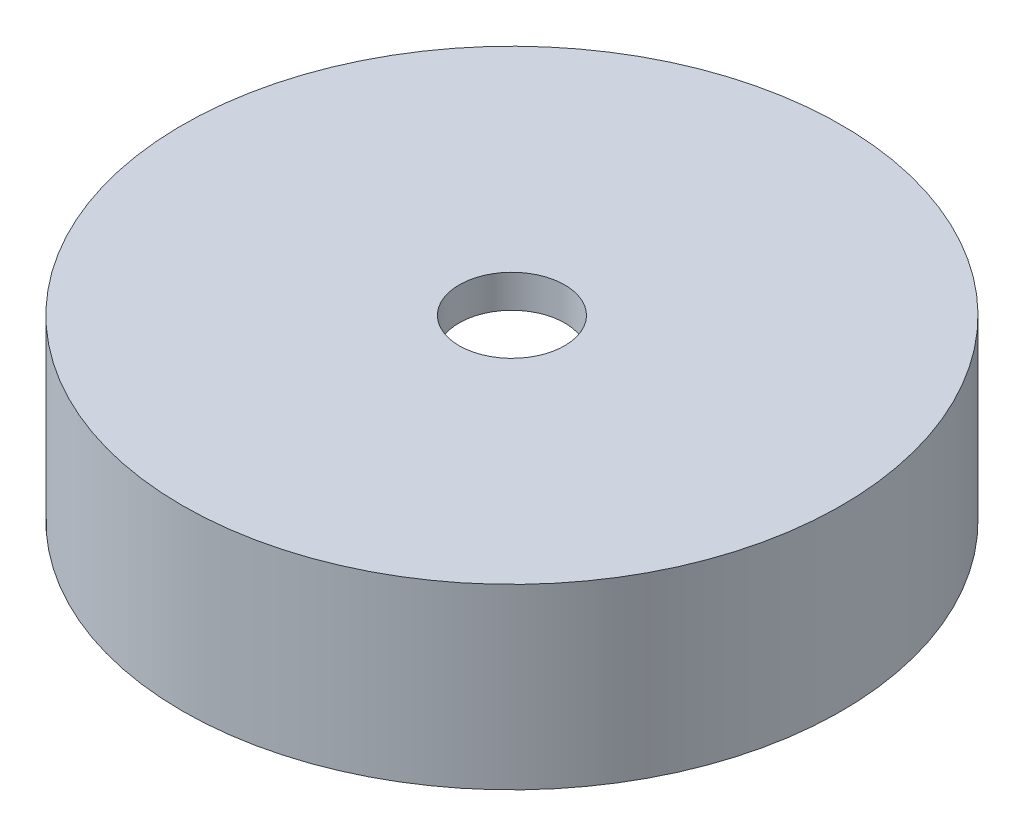
ISO-10303-21;
HEADER;
FILE_DESCRIPTION(('STEP AP214'),'2;1');
FILE_NAME('part.step','',(''),(''),'','','');
FILE_SCHEMA(('AUTOMOTIVE_DESIGN { 1 0 10303 214 1 1 1 1 }'));
ENDSEC;
DATA;
#1=APPLICATION_CONTEXT('core data for automotive mechanical design processes');
#2=APPLICATION_PROTOCOL_DEFINITION('international standard','automotive_design',2000,#1);
#3=PRODUCT_CONTEXT('',#1,'mechanical');
#4=PRODUCT('Part','Part','',(#3));
#5=PRODUCT_RELATED_PRODUCT_CATEGORY('part','',(#4));
#6=PRODUCT_DEFINITION_FORMATION('','',#4);
#7=PRODUCT_DEFINITION_CONTEXT('part definition',#1,'design');
#8=PRODUCT_DEFINITION('design','',#6,#7);
#9=PRODUCT_DEFINITION_SHAPE('','',#8);
#10=(LENGTH_UNIT() NAMED_UNIT(*) SI_UNIT(.MILLI.,.METRE.));
#11=(NAMED_UNIT(*) PLANE_ANGLE_UNIT() SI_UNIT($,.RADIAN.));
#12=(NAMED_UNIT(*) SI_UNIT($,.STERADIAN.) SOLID_ANGLE_UNIT());
#13=UNCERTAINTY_MEASURE_WITH_UNIT(LENGTH_MEASURE(1.E-05),#10,'distance_accuracy_value','');
#14=(GEOMETRIC_REPRESENTATION_CONTEXT(3) GLOBAL_UNCERTAINTY_ASSIGNED_CONTEXT((#13)) GLOBAL_UNIT_ASSIGNED_CONTEXT((#10,
#11,#12)) REPRESENTATION_CONTEXT('',''));
#15=CARTESIAN_POINT('',(0.,0.,0.));
#16=DIRECTION('',(0.,0.,1.));
#17=DIRECTION('',(1.,0.,0.));
#18=AXIS2_PLACEMENT_3D('',#15,#16,#17);
#19=CARTESIAN_POINT('',(0.,0.,0.));
#20=DIRECTION('',(0.,1.,0.));
#21=DIRECTION('',(0.,0.,1.));
#22=AXIS2_PLACEMENT_3D('',#19,#20,#21);
#23=PLANE('',#22);
#24=CARTESIAN_POINT('',(0.,0.,0.));
#25=DIRECTION('',(0.,1.,0.));
#26=DIRECTION('',(0.,0.,1.));
#27=AXIS2_PLACEMENT_3D('',#24,#25,#26);
#28=CIRCLE('',#27,50.);
#29=CARTESIAN_POINT('',(0.,0.,50.));
#30=VERTEX_POINT('',#29);
#31=EDGE_CURVE('E10',#30,#30,#28,.T.);
#32=ORIENTED_EDGE('',*,*,#31,.F.);
#33=EDGE_LOOP('',(#32));
#34=FACE_BOUND('',#33,.T.);
#35=CARTESIAN_POINT('',(0.,0.,0.));
#36=DIRECTION('',(0.,1.,0.));
#37=DIRECTION('',(0.,0.,1.));
#38=AXIS2_PLACEMENT_3D('',#35,#36,#37);
#39=CIRCLE('',#38,45.);
#40=CARTESIAN_POINT('',(0.,0.,45.));
#41=VERTEX_POINT('',#40);
#42=EDGE_CURVE('E40',#41,#41,#39,.T.);
#43=ORIENTED_EDGE('',*,*,#42,.T.);
#44=EDGE_LOOP('',(#43));
#45=FACE_BOUND('',#44,.T.);
#46=ADVANCED_FACE('F33',(#34,#45),#23,.F.);
#47=CARTESIAN_POINT('',(0.,22.,0.));
#48=DIRECTION('',(0.,-1.,0.));
#49=DIRECTION('',(0.,0.,-1.));
#50=AXIS2_PLACEMENT_3D('',#47,#48,#49);
#51=CYLINDRICAL_SURFACE('',#50,50.);
#52=ORIENTED_EDGE('',*,*,#31,.T.);
#53=EDGE_LOOP('',(#52));
#54=FACE_BOUND('',#53,.T.);
#55=CARTESIAN_POINT('',(0.,27.,0.));
#56=DIRECTION('',(0.,1.,0.));
#57=DIRECTION('',(0.,0.,1.));
#58=AXIS2_PLACEMENT_3D('',#55,#56,#57);
#59=CIRCLE('',#58,50.);
#60=CARTESIAN_POINT('',(0.,27.,50.));
#61=VERTEX_POINT('',#60);
#62=EDGE_CURVE('E48',#61,#61,#59,.T.);
#63=ORIENTED_EDGE('',*,*,#62,.F.);
#64=EDGE_LOOP('',(#63));
#65=FACE_BOUND('',#64,.T.);
#66=ADVANCED_FACE('F35',(#54,#65),#51,.T.);
#67=CARTESIAN_POINT('',(0.,22.,0.));
#68=DIRECTION('',(0.,-1.,0.));
#69=DIRECTION('',(0.,0.,-1.));
#70=AXIS2_PLACEMENT_3D('',#67,#68,#69);
#71=CYLINDRICAL_SURFACE('',#70,45.);
#72=CARTESIAN_POINT('',(0.,22.,0.));
#73=DIRECTION('',(0.,1.,0.));
#74=DIRECTION('',(0.,0.,1.));
#75=AXIS2_PLACEMENT_3D('',#72,#73,#74);
#76=CIRCLE('',#75,45.);
#77=CARTESIAN_POINT('',(0.,22.,45.));
#78=VERTEX_POINT('',#77);
#79=EDGE_CURVE('E44',#78,#78,#76,.T.);
#80=ORIENTED_EDGE('',*,*,#79,.T.);
#81=EDGE_LOOP('',(#80));
#82=FACE_BOUND('',#81,.T.);
#83=ORIENTED_EDGE('',*,*,#42,.F.);
#84=EDGE_LOOP('',(#83));
#85=FACE_BOUND('',#84,.T.);
#86=ADVANCED_FACE('F70',(#82,#85),#71,.F.);
#87=CARTESIAN_POINT('',(0.,22.,0.));
#88=DIRECTION('',(0.,1.,0.));
#89=DIRECTION('',(0.,0.,1.));
#90=AXIS2_PLACEMENT_3D('',#87,#88,#89);
#91=PLANE('',#90);
#92=CARTESIAN_POINT('',(0.,22.,0.));
#93=DIRECTION('',(0.,1.,0.));
#94=DIRECTION('',(0.,0.,1.));
#95=AXIS2_PLACEMENT_3D('',#92,#93,#94);
#96=CIRCLE('',#95,8.);
#97=CARTESIAN_POINT('',(0.,22.,8.));
#98=VERTEX_POINT('',#97);
#99=EDGE_CURVE('E51',#98,#98,#96,.T.);
#100=ORIENTED_EDGE('',*,*,#99,.T.);
#101=EDGE_LOOP('',(#100));
#102=FACE_BOUND('',#101,.T.);
#103=ORIENTED_EDGE('',*,*,#79,.F.);
#104=EDGE_LOOP('',(#103));
#105=FACE_BOUND('',#104,.T.);
#106=ADVANCED_FACE('F75',(#102,#105),#91,.F.);
#107=CARTESIAN_POINT('',(0.,27.,0.));
#108=DIRECTION('',(0.,-1.,0.));
#109=DIRECTION('',(0.,0.,-1.));
#110=AXIS2_PLACEMENT_3D('',#107,#108,#109);
#111=CYLINDRICAL_SURFACE('',#110,8.);
#112=CARTESIAN_POINT('',(0.,27.,0.));
#113=DIRECTION('',(0.,1.,0.));
#114=DIRECTION('',(0.,0.,1.));
#115=AXIS2_PLACEMENT_3D('',#112,#113,#114);
#116=CIRCLE('',#115,8.);
#117=CARTESIAN_POINT('',(0.,27.,8.));
#118=VERTEX_POINT('',#117);
#119=EDGE_CURVE('E54',#118,#118,#116,.T.);
#120=ORIENTED_EDGE('',*,*,#119,.T.);
#121=EDGE_LOOP('',(#120));
#122=FACE_BOUND('',#121,.T.);
#123=ORIENTED_EDGE('',*,*,#99,.F.);
#124=EDGE_LOOP('',(#123));
#125=FACE_BOUND('',#124,.T.);
#126=ADVANCED_FACE('F60',(#122,#125),#111,.F.);
#127=CARTESIAN_POINT('',(0.,27.,0.));
#128=DIRECTION('',(0.,1.,0.));
#129=DIRECTION('',(0.,0.,1.));
#130=AXIS2_PLACEMENT_3D('',#127,#128,#129);
#131=PLANE('',#130);
#132=ORIENTED_EDGE('',*,*,#119,.F.);
#133=EDGE_LOOP('',(#132));
#134=FACE_BOUND('',#133,.T.);
#135=ORIENTED_EDGE('',*,*,#62,.T.);
#136=EDGE_LOOP('',(#135));
#137=FACE_BOUND('',#136,.T.);
#138=ADVANCED_FACE('F63',(#134,#137),#131,.T.);
#139=CLOSED_SHELL('',(#46,#66,#86,#106,#126,#138));
#140=MANIFOLD_SOLID_BREP('B2',#139);
#141=ADVANCED_BREP_SHAPE_REPRESENTATION('',(#18,#140),#14);
#142=SHAPE_DEFINITION_REPRESENTATION(#9,#141);
ENDSEC;
END-ISO-10303-21;
